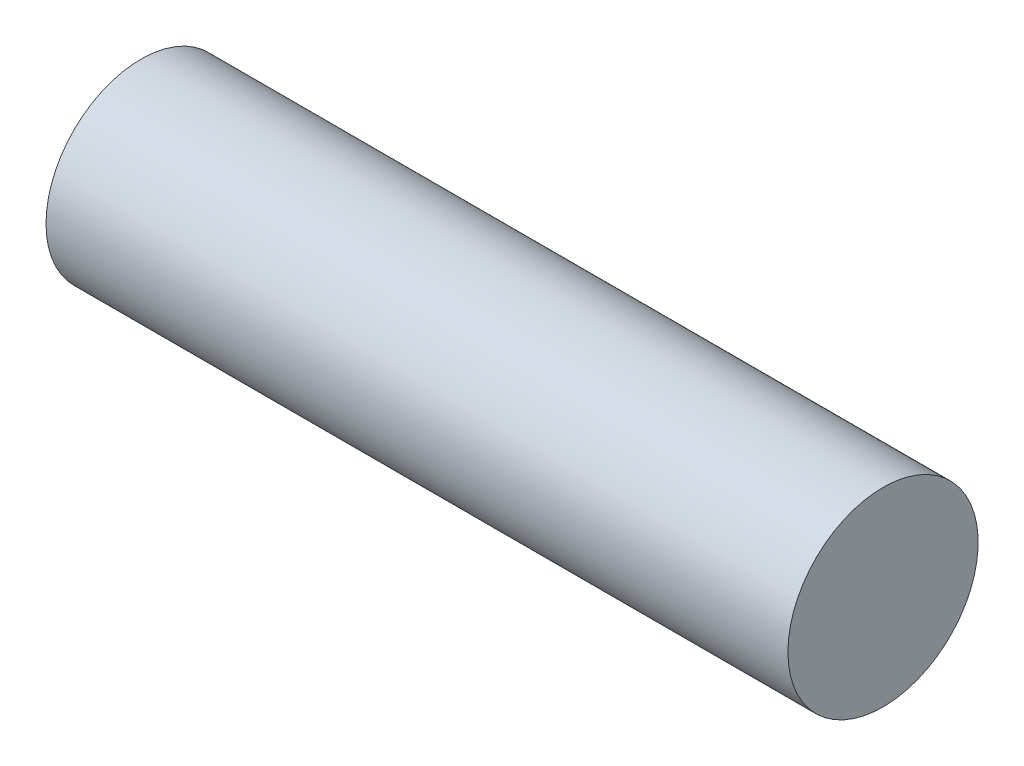
ISO-10303-21;
HEADER;
FILE_DESCRIPTION(('STEP AP214'),'2;1');
FILE_NAME('part.step','',(''),(''),'','','');
FILE_SCHEMA(('AUTOMOTIVE_DESIGN { 1 0 10303 214 1 1 1 1 }'));
ENDSEC;
DATA;
#1=APPLICATION_CONTEXT('core data for automotive mechanical design processes');
#2=APPLICATION_PROTOCOL_DEFINITION('international standard','automotive_design',2000,#1);
#3=PRODUCT_CONTEXT('',#1,'mechanical');
#4=PRODUCT('Part','Part','',(#3));
#5=PRODUCT_RELATED_PRODUCT_CATEGORY('part','',(#4));
#6=PRODUCT_DEFINITION_FORMATION('','',#4);
#7=PRODUCT_DEFINITION_CONTEXT('part definition',#1,'design');
#8=PRODUCT_DEFINITION('design','',#6,#7);
#9=PRODUCT_DEFINITION_SHAPE('','',#8);
#10=(LENGTH_UNIT() NAMED_UNIT(*) SI_UNIT(.MILLI.,.METRE.));
#11=(NAMED_UNIT(*) PLANE_ANGLE_UNIT() SI_UNIT($,.RADIAN.));
#12=(NAMED_UNIT(*) SI_UNIT($,.STERADIAN.) SOLID_ANGLE_UNIT());
#13=UNCERTAINTY_MEASURE_WITH_UNIT(LENGTH_MEASURE(1.E-05),#10,'distance_accuracy_value','');
#14=(GEOMETRIC_REPRESENTATION_CONTEXT(3) GLOBAL_UNCERTAINTY_ASSIGNED_CONTEXT((#13)) GLOBAL_UNIT_ASSIGNED_CONTEXT((#10,
#11,#12)) REPRESENTATION_CONTEXT('',''));
#15=CARTESIAN_POINT('',(0.,0.,0.));
#16=DIRECTION('',(0.,0.,1.));
#17=DIRECTION('',(1.,0.,0.));
#18=AXIS2_PLACEMENT_3D('',#15,#16,#17);
#19=CARTESIAN_POINT('',(-12.3825,0.,0.));
#20=DIRECTION('',(-1.,0.,0.));
#21=DIRECTION('',(0.,0.,1.));
#22=AXIS2_PLACEMENT_3D('',#19,#20,#21);
#23=CYLINDRICAL_SURFACE('',#22,3.175);
#24=CARTESIAN_POINT('',(12.3825,0.,0.));
#25=DIRECTION('',(-1.,0.,0.));
#26=DIRECTION('',(0.,0.,1.));
#27=AXIS2_PLACEMENT_3D('',#24,#25,#26);
#28=CIRCLE('',#27,3.175);
#29=CARTESIAN_POINT('',(12.3825,0.,3.175));
#30=VERTEX_POINT('',#29);
#31=EDGE_CURVE('E10',#30,#30,#28,.T.);
#32=ORIENTED_EDGE('',*,*,#31,.T.);
#33=EDGE_LOOP('',(#32));
#34=FACE_BOUND('',#33,.T.);
#35=CARTESIAN_POINT('',(-12.3825,0.,0.));
#36=DIRECTION('',(-1.,0.,0.));
#37=DIRECTION('',(0.,0.,1.));
#38=AXIS2_PLACEMENT_3D('',#35,#36,#37);
#39=CIRCLE('',#38,3.175);
#40=CARTESIAN_POINT('',(-12.3825,0.,3.175));
#41=VERTEX_POINT('',#40);
#42=EDGE_CURVE('E49',#41,#41,#39,.T.);
#43=ORIENTED_EDGE('',*,*,#42,.F.);
#44=EDGE_LOOP('',(#43));
#45=FACE_BOUND('',#44,.T.);
#46=ADVANCED_FACE('F43',(#34,#45),#23,.T.);
#47=CARTESIAN_POINT('',(12.3825,0.,0.));
#48=DIRECTION('',(1.,0.,0.));
#49=DIRECTION('',(0.,0.,-1.));
#50=AXIS2_PLACEMENT_3D('',#47,#48,#49);
#51=PLANE('',#50);
#52=ORIENTED_EDGE('',*,*,#31,.F.);
#53=EDGE_LOOP('',(#52));
#54=FACE_BOUND('',#53,.T.);
#55=ADVANCED_FACE('F58',(#54),#51,.T.);
#56=CARTESIAN_POINT('',(-12.3825,0.,0.));
#57=DIRECTION('',(1.,0.,0.));
#58=DIRECTION('',(0.,0.,-1.));
#59=AXIS2_PLACEMENT_3D('',#56,#57,#58);
#60=PLANE('',#59);
#61=ORIENTED_EDGE('',*,*,#42,.T.);
#62=EDGE_LOOP('',(#61));
#63=FACE_BOUND('',#62,.T.);
#64=ADVANCED_FACE('F55',(#63),#60,.F.);
#65=CLOSED_SHELL('',(#46,#55,#64));
#66=MANIFOLD_SOLID_BREP('B2',#65);
#67=ADVANCED_BREP_SHAPE_REPRESENTATION('',(#18,#66),#14);
#68=SHAPE_DEFINITION_REPRESENTATION(#9,#67);
ENDSEC;
END-ISO-10303-21;
